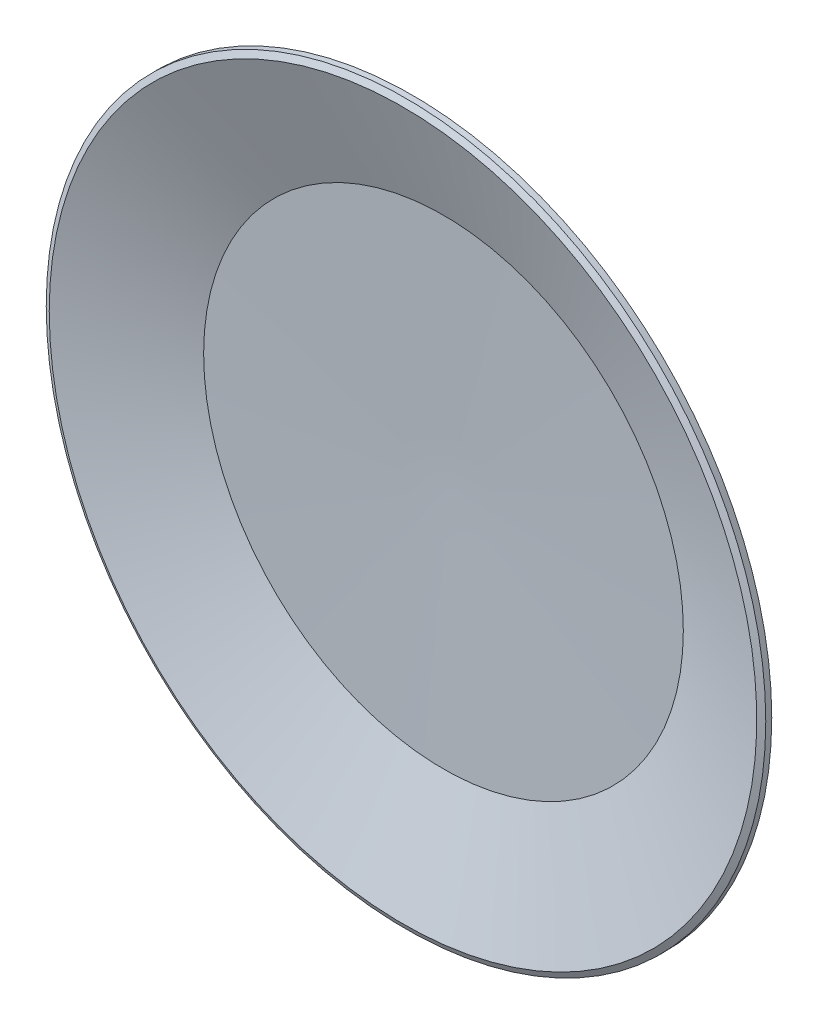
ISO-10303-21;
HEADER;
FILE_DESCRIPTION(('STEP AP214'),'2;1');
FILE_NAME('part.step','',(''),(''),'','','');
FILE_SCHEMA(('AUTOMOTIVE_DESIGN { 1 0 10303 214 1 1 1 1 }'));
ENDSEC;
DATA;
#1=APPLICATION_CONTEXT('core data for automotive mechanical design processes');
#2=APPLICATION_PROTOCOL_DEFINITION('international standard','automotive_design',2000,#1);
#3=PRODUCT_CONTEXT('',#1,'mechanical');
#4=PRODUCT('Part','Part','',(#3));
#5=PRODUCT_RELATED_PRODUCT_CATEGORY('part','',(#4));
#6=PRODUCT_DEFINITION_FORMATION('','',#4);
#7=PRODUCT_DEFINITION_CONTEXT('part definition',#1,'design');
#8=PRODUCT_DEFINITION('design','',#6,#7);
#9=PRODUCT_DEFINITION_SHAPE('','',#8);
#10=(LENGTH_UNIT() NAMED_UNIT(*) SI_UNIT(.MILLI.,.METRE.));
#11=(NAMED_UNIT(*) PLANE_ANGLE_UNIT() SI_UNIT($,.RADIAN.));
#12=(NAMED_UNIT(*) SI_UNIT($,.STERADIAN.) SOLID_ANGLE_UNIT());
#13=UNCERTAINTY_MEASURE_WITH_UNIT(LENGTH_MEASURE(1.E-05),#10,'distance_accuracy_value','');
#14=(GEOMETRIC_REPRESENTATION_CONTEXT(3) GLOBAL_UNCERTAINTY_ASSIGNED_CONTEXT((#13)) GLOBAL_UNIT_ASSIGNED_CONTEXT((#10,
#11,#12)) REPRESENTATION_CONTEXT('',''));
#15=CARTESIAN_POINT('',(0.,0.,0.));
#16=DIRECTION('',(0.,0.,1.));
#17=DIRECTION('',(1.,0.,0.));
#18=AXIS2_PLACEMENT_3D('',#15,#16,#17);
#19=CARTESIAN_POINT('',(0.,0.,2.));
#20=DIRECTION('',(0.,0.,1.));
#21=DIRECTION('',(1.,0.,0.));
#22=AXIS2_PLACEMENT_3D('',#19,#20,#21);
#23=PLANE('',#22);
#24=CARTESIAN_POINT('',(0.,0.,2.));
#25=DIRECTION('',(0.,0.,-1.));
#26=DIRECTION('',(-1.,0.,0.));
#27=AXIS2_PLACEMENT_3D('',#24,#25,#26);
#28=CIRCLE('',#27,66.);
#29=CARTESIAN_POINT('',(-66.,0.,2.));
#30=VERTEX_POINT('',#29);
#31=EDGE_CURVE('E11',#30,#30,#28,.T.);
#32=ORIENTED_EDGE('',*,*,#31,.T.);
#33=EDGE_LOOP('',(#32));
#34=FACE_BOUND('',#33,.T.);
#35=ADVANCED_FACE('F43',(#34),#23,.F.);
#36=CARTESIAN_POINT('',(0.,0.,0.));
#37=DIRECTION('',(0.,0.,-1.));
#38=DIRECTION('',(-1.,0.,0.));
#39=AXIS2_PLACEMENT_3D('',#36,#37,#38);
#40=CONICAL_SURFACE('',#39,68.,0.785398163397448);
#41=ORIENTED_EDGE('',*,*,#31,.F.);
#42=EDGE_LOOP('',(#41));
#43=FACE_BOUND('',#42,.T.);
#44=CARTESIAN_POINT('',(0.,0.,0.));
#45=DIRECTION('',(0.,0.,-1.));
#46=DIRECTION('',(-1.,0.,0.));
#47=AXIS2_PLACEMENT_3D('',#44,#45,#46);
#48=CIRCLE('',#47,68.);
#49=CARTESIAN_POINT('',(-68.,0.,0.));
#50=VERTEX_POINT('',#49);
#51=EDGE_CURVE('E49',#50,#50,#48,.T.);
#52=ORIENTED_EDGE('',*,*,#51,.T.);
#53=EDGE_LOOP('',(#52));
#54=FACE_BOUND('',#53,.T.);
#55=ADVANCED_FACE('F65',(#43,#54),#40,.F.);
#56=CARTESIAN_POINT('',(68.,0.,0.));
#57=DIRECTION('',(0.,0.,1.));
#58=DIRECTION('',(1.,0.,0.));
#59=AXIS2_PLACEMENT_3D('',#56,#57,#58);
#60=PLANE('',#59);
#61=ORIENTED_EDGE('',*,*,#51,.F.);
#62=EDGE_LOOP('',(#61));
#63=FACE_BOUND('',#62,.T.);
#64=CARTESIAN_POINT('',(0.,0.,0.));
#65=DIRECTION('',(0.,0.,-1.));
#66=DIRECTION('',(-1.,0.,0.));
#67=AXIS2_PLACEMENT_3D('',#64,#65,#66);
#68=CIRCLE('',#67,72.);
#69=CARTESIAN_POINT('',(-72.,0.,0.));
#70=VERTEX_POINT('',#69);
#71=EDGE_CURVE('E77',#70,#70,#68,.T.);
#72=ORIENTED_EDGE('',*,*,#71,.T.);
#73=EDGE_LOOP('',(#72));
#74=FACE_BOUND('',#73,.T.);
#75=ADVANCED_FACE('F70',(#63,#74),#60,.F.);
#76=CARTESIAN_POINT('',(0.,0.,2.49999999999995));
#77=DIRECTION('',(0.,0.,1.));
#78=DIRECTION('',(1.,0.,0.));
#79=AXIS2_PLACEMENT_3D('',#76,#77,#78);
#80=CONICAL_SURFACE('',#79,74.,0.674740942223564);
#81=ORIENTED_EDGE('',*,*,#71,.F.);
#82=EDGE_LOOP('',(#81));
#83=FACE_BOUND('',#82,.T.);
#84=CARTESIAN_POINT('',(0.,0.,2.49999999999995));
#85=DIRECTION('',(0.,0.,-1.));
#86=DIRECTION('',(-1.,0.,0.));
#87=AXIS2_PLACEMENT_3D('',#84,#85,#86);
#88=CIRCLE('',#87,74.);
#89=CARTESIAN_POINT('',(-74.,0.,2.49999999999995));
#90=VERTEX_POINT('',#89);
#91=EDGE_CURVE('E79',#90,#90,#88,.T.);
#92=ORIENTED_EDGE('',*,*,#91,.T.);
#93=EDGE_LOOP('',(#92));
#94=FACE_BOUND('',#93,.T.);
#95=ADVANCED_FACE('F119',(#83,#94),#80,.T.);
#96=CARTESIAN_POINT('',(0.,0.,5.));
#97=DIRECTION('',(0.,0.,1.));
#98=DIRECTION('',(1.,0.,0.));
#99=AXIS2_PLACEMENT_3D('',#96,#97,#98);
#100=CONICAL_SURFACE('',#99,82.,1.26791145841992);
#101=ORIENTED_EDGE('',*,*,#91,.F.);
#102=EDGE_LOOP('',(#101));
#103=FACE_BOUND('',#102,.T.);
#104=CARTESIAN_POINT('',(0.,0.,5.));
#105=DIRECTION('',(0.,0.,-1.));
#106=DIRECTION('',(-1.,0.,0.));
#107=AXIS2_PLACEMENT_3D('',#104,#105,#106);
#108=CIRCLE('',#107,82.);
#109=CARTESIAN_POINT('',(-82.,0.,5.));
#110=VERTEX_POINT('',#109);
#111=EDGE_CURVE('E84',#110,#110,#108,.T.);
#112=ORIENTED_EDGE('',*,*,#111,.T.);
#113=EDGE_LOOP('',(#112));
#114=FACE_BOUND('',#113,.T.);
#115=ADVANCED_FACE('F115',(#103,#114),#100,.T.);
#116=CARTESIAN_POINT('',(0.,0.,19.));
#117=DIRECTION('',(0.,0.,1.));
#118=DIRECTION('',(1.,0.,0.));
#119=AXIS2_PLACEMENT_3D('',#116,#117,#118);
#120=CONICAL_SURFACE('',#119,120.,1.21780593896799);
#121=ORIENTED_EDGE('',*,*,#111,.F.);
#122=EDGE_LOOP('',(#121));
#123=FACE_BOUND('',#122,.T.);
#124=CARTESIAN_POINT('',(0.,0.,19.));
#125=DIRECTION('',(0.,0.,-1.));
#126=DIRECTION('',(-1.,0.,0.));
#127=AXIS2_PLACEMENT_3D('',#124,#125,#126);
#128=CIRCLE('',#127,120.);
#129=CARTESIAN_POINT('',(-120.,0.,19.));
#130=VERTEX_POINT('',#129);
#131=EDGE_CURVE('E87',#130,#130,#128,.T.);
#132=ORIENTED_EDGE('',*,*,#131,.T.);
#133=EDGE_LOOP('',(#132));
#134=FACE_BOUND('',#133,.T.);
#135=ADVANCED_FACE('F108',(#123,#134),#120,.T.);
#136=CARTESIAN_POINT('',(0.,0.,-500.));
#137=DIRECTION('',(0.,0.,-1.));
#138=DIRECTION('',(-1.,0.,0.));
#139=AXIS2_PLACEMENT_3D('',#136,#137,#138);
#140=CYLINDRICAL_SURFACE('',#139,120.);
#141=ORIENTED_EDGE('',*,*,#131,.F.);
#142=EDGE_LOOP('',(#141));
#143=FACE_BOUND('',#142,.T.);
#144=CARTESIAN_POINT('',(0.,0.,21.));
#145=DIRECTION('',(0.,0.,-1.));
#146=DIRECTION('',(-1.,0.,0.));
#147=AXIS2_PLACEMENT_3D('',#144,#145,#146);
#148=CIRCLE('',#147,120.);
#149=CARTESIAN_POINT('',(-120.,0.,21.));
#150=VERTEX_POINT('',#149);
#151=EDGE_CURVE('E90',#150,#150,#148,.T.);
#152=ORIENTED_EDGE('',*,*,#151,.T.);
#153=EDGE_LOOP('',(#152));
#154=FACE_BOUND('',#153,.T.);
#155=ADVANCED_FACE('F102',(#143,#154),#140,.T.);
#156=CARTESIAN_POINT('',(0.,0.,22.));
#157=DIRECTION('',(0.,0.,-1.));
#158=DIRECTION('',(-1.,0.,0.));
#159=AXIS2_PLACEMENT_3D('',#156,#157,#158);
#160=CONICAL_SURFACE('',#159,118.,1.10714871779409);
#161=ORIENTED_EDGE('',*,*,#151,.F.);
#162=EDGE_LOOP('',(#161));
#163=FACE_BOUND('',#162,.T.);
#164=CARTESIAN_POINT('',(0.,0.,22.));
#165=DIRECTION('',(0.,0.,-1.));
#166=DIRECTION('',(-1.,0.,0.));
#167=AXIS2_PLACEMENT_3D('',#164,#165,#166);
#168=CIRCLE('',#167,118.);
#169=CARTESIAN_POINT('',(-118.,0.,22.));
#170=VERTEX_POINT('',#169);
#171=EDGE_CURVE('E93',#170,#170,#168,.T.);
#172=ORIENTED_EDGE('',*,*,#171,.T.);
#173=EDGE_LOOP('',(#172));
#174=FACE_BOUND('',#173,.T.);
#175=ADVANCED_FACE('F60',(#163,#174),#160,.T.);
#176=CARTESIAN_POINT('',(0.,0.,8.49999999999995));
#177=DIRECTION('',(0.,0.,1.));
#178=DIRECTION('',(1.,0.,0.));
#179=AXIS2_PLACEMENT_3D('',#176,#177,#178);
#180=CONICAL_SURFACE('',#179,80.,1.22944044154105);
#181=ORIENTED_EDGE('',*,*,#171,.F.);
#182=EDGE_LOOP('',(#181));
#183=FACE_BOUND('',#182,.T.);
#184=CARTESIAN_POINT('',(0.,0.,8.49999999999995));
#185=DIRECTION('',(0.,0.,-1.));
#186=DIRECTION('',(-1.,0.,0.));
#187=AXIS2_PLACEMENT_3D('',#184,#185,#186);
#188=CIRCLE('',#187,80.);
#189=CARTESIAN_POINT('',(-80.,0.,8.49999999999995));
#190=VERTEX_POINT('',#189);
#191=EDGE_CURVE('E96',#190,#190,#188,.T.);
#192=ORIENTED_EDGE('',*,*,#191,.T.);
#193=EDGE_LOOP('',(#192));
#194=FACE_BOUND('',#193,.T.);
#195=ADVANCED_FACE('F54',(#183,#194),#180,.F.);
#196=CARTESIAN_POINT('',(0.,0.,6.49999999999995));
#197=DIRECTION('',(0.,0.,1.));
#198=DIRECTION('',(1.,0.,0.));
#199=AXIS2_PLACEMENT_3D('',#196,#197,#198);
#200=CONICAL_SURFACE('',#199,0.,1.54580153317598);
#201=ORIENTED_EDGE('',*,*,#191,.F.);
#202=EDGE_LOOP('',(#201));
#203=FACE_BOUND('',#202,.T.);
#204=CARTESIAN_POINT('',(0.,0.,6.5));
#205=VERTEX_POINT('',#204);
#206=VERTEX_LOOP('',#205);
#207=FACE_BOUND('',#206,.T.);
#208=ADVANCED_FACE('F52',(#203,#207),#200,.F.);
#209=CLOSED_SHELL('',(#35,#55,#75,#95,#115,#135,#155,#175,#195,#208));
#210=MANIFOLD_SOLID_BREP('B2',#209);
#211=ADVANCED_BREP_SHAPE_REPRESENTATION('',(#18,#210),#14);
#212=SHAPE_DEFINITION_REPRESENTATION(#9,#211);
ENDSEC;
END-ISO-10303-21;
